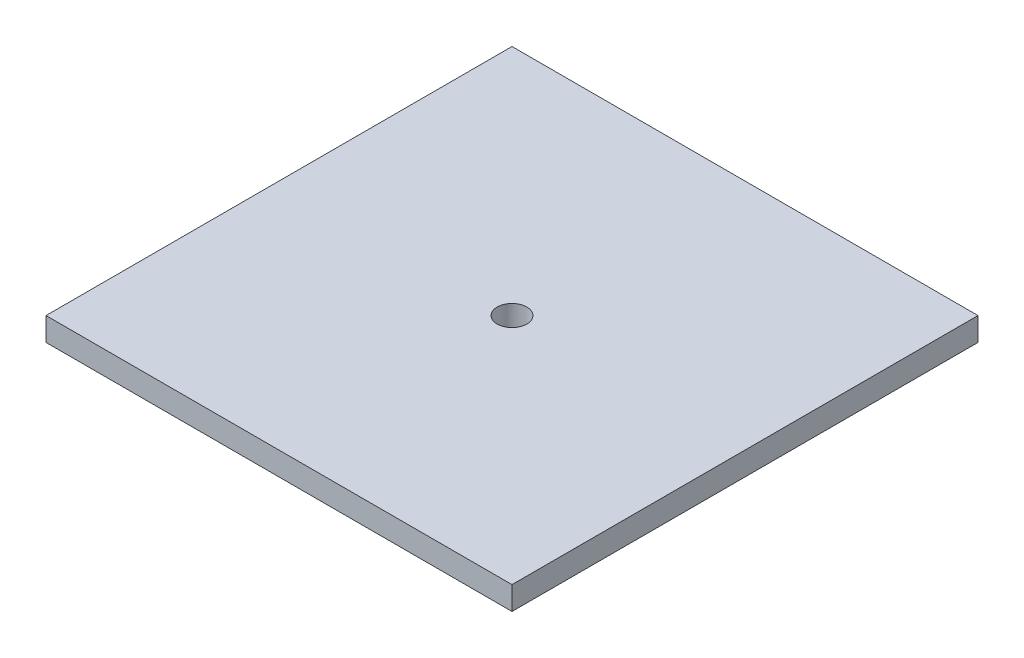
ISO-10303-21;
HEADER;
FILE_DESCRIPTION(('STEP AP214'),'2;1');
FILE_NAME('part.step','',(''),(''),'','','');
FILE_SCHEMA(('AUTOMOTIVE_DESIGN { 1 0 10303 214 1 1 1 1 }'));
ENDSEC;
DATA;
#1=APPLICATION_CONTEXT('core data for automotive mechanical design processes');
#2=APPLICATION_PROTOCOL_DEFINITION('international standard','automotive_design',2000,#1);
#3=PRODUCT_CONTEXT('',#1,'mechanical');
#4=PRODUCT('Part','Part','',(#3));
#5=PRODUCT_RELATED_PRODUCT_CATEGORY('part','',(#4));
#6=PRODUCT_DEFINITION_FORMATION('','',#4);
#7=PRODUCT_DEFINITION_CONTEXT('part definition',#1,'design');
#8=PRODUCT_DEFINITION('design','',#6,#7);
#9=PRODUCT_DEFINITION_SHAPE('','',#8);
#10=(LENGTH_UNIT() NAMED_UNIT(*) SI_UNIT(.MILLI.,.METRE.));
#11=(NAMED_UNIT(*) PLANE_ANGLE_UNIT() SI_UNIT($,.RADIAN.));
#12=(NAMED_UNIT(*) SI_UNIT($,.STERADIAN.) SOLID_ANGLE_UNIT());
#13=UNCERTAINTY_MEASURE_WITH_UNIT(LENGTH_MEASURE(1.E-05),#10,'distance_accuracy_value','');
#14=(GEOMETRIC_REPRESENTATION_CONTEXT(3) GLOBAL_UNCERTAINTY_ASSIGNED_CONTEXT((#13)) GLOBAL_UNIT_ASSIGNED_CONTEXT((#10,
#11,#12)) REPRESENTATION_CONTEXT('',''));
#15=CARTESIAN_POINT('',(0.,0.,0.));
#16=DIRECTION('',(0.,0.,1.));
#17=DIRECTION('',(1.,0.,0.));
#18=AXIS2_PLACEMENT_3D('',#15,#16,#17);
#19=CARTESIAN_POINT('',(0.,5.,0.));
#20=DIRECTION('',(0.,1.,0.));
#21=DIRECTION('',(0.,0.,1.));
#22=AXIS2_PLACEMENT_3D('',#19,#20,#21);
#23=PLANE('',#22);
#24=DIRECTION('',(0.,0.,1.));
#25=VECTOR('',#24,1.);
#26=CARTESIAN_POINT('',(-50.,5.,50.));
#27=LINE('',#26,#25);
#28=CARTESIAN_POINT('',(-50.,5.,-50.));
#29=VERTEX_POINT('',#28);
#30=CARTESIAN_POINT('',(-50.,5.,50.));
#31=VERTEX_POINT('',#30);
#32=EDGE_CURVE('E89',#29,#31,#27,.T.);
#33=ORIENTED_EDGE('',*,*,#32,.T.);
#34=DIRECTION('',(1.,0.,0.));
#35=VECTOR('',#34,1.);
#36=CARTESIAN_POINT('',(50.,5.,50.));
#37=LINE('',#36,#35);
#38=CARTESIAN_POINT('',(50.,5.,50.));
#39=VERTEX_POINT('',#38);
#40=EDGE_CURVE('E84',#31,#39,#37,.T.);
#41=ORIENTED_EDGE('',*,*,#40,.T.);
#42=DIRECTION('',(0.,0.,-1.));
#43=VECTOR('',#42,1.);
#44=CARTESIAN_POINT('',(50.,5.,50.));
#45=LINE('',#44,#43);
#46=CARTESIAN_POINT('',(50.,5.,-50.));
#47=VERTEX_POINT('',#46);
#48=EDGE_CURVE('E87',#39,#47,#45,.T.);
#49=ORIENTED_EDGE('',*,*,#48,.T.);
#50=DIRECTION('',(-1.,0.,0.));
#51=VECTOR('',#50,1.);
#52=CARTESIAN_POINT('',(50.,5.,-50.));
#53=LINE('',#52,#51);
#54=EDGE_CURVE('E54',#47,#29,#53,.T.);
#55=ORIENTED_EDGE('',*,*,#54,.T.);
#56=EDGE_LOOP('',(#33,#41,#49,#55));
#57=FACE_BOUND('',#56,.T.);
#58=CARTESIAN_POINT('',(0.,5.,0.));
#59=DIRECTION('',(0.,1.,0.));
#60=DIRECTION('',(0.,0.,1.));
#61=AXIS2_PLACEMENT_3D('',#58,#59,#60);
#62=CIRCLE('',#61,3.175);
#63=CARTESIAN_POINT('',(0.,5.,3.175));
#64=VERTEX_POINT('',#63);
#65=EDGE_CURVE('E104',#64,#64,#62,.T.);
#66=ORIENTED_EDGE('',*,*,#65,.F.);
#67=EDGE_LOOP('',(#66));
#68=FACE_BOUND('',#67,.T.);
#69=ADVANCED_FACE('F37',(#57,#68),#23,.T.);
#70=CARTESIAN_POINT('',(0.,0.,0.));
#71=DIRECTION('',(0.,1.,0.));
#72=DIRECTION('',(0.,0.,1.));
#73=AXIS2_PLACEMENT_3D('',#70,#71,#72);
#74=PLANE('',#73);
#75=DIRECTION('',(0.,0.,1.));
#76=VECTOR('',#75,1.);
#77=CARTESIAN_POINT('',(-50.,0.,50.));
#78=LINE('',#77,#76);
#79=CARTESIAN_POINT('',(-50.,0.,-50.));
#80=VERTEX_POINT('',#79);
#81=CARTESIAN_POINT('',(-50.,0.,50.));
#82=VERTEX_POINT('',#81);
#83=EDGE_CURVE('E101',#80,#82,#78,.T.);
#84=ORIENTED_EDGE('',*,*,#83,.F.);
#85=DIRECTION('',(-1.,0.,0.));
#86=VECTOR('',#85,1.);
#87=CARTESIAN_POINT('',(50.,0.,-50.));
#88=LINE('',#87,#86);
#89=CARTESIAN_POINT('',(50.,0.,-50.));
#90=VERTEX_POINT('',#89);
#91=EDGE_CURVE('E77',#90,#80,#88,.T.);
#92=ORIENTED_EDGE('',*,*,#91,.F.);
#93=DIRECTION('',(0.,0.,-1.));
#94=VECTOR('',#93,1.);
#95=CARTESIAN_POINT('',(50.,0.,50.));
#96=LINE('',#95,#94);
#97=CARTESIAN_POINT('',(50.,0.,50.));
#98=VERTEX_POINT('',#97);
#99=EDGE_CURVE('E71',#98,#90,#96,.T.);
#100=ORIENTED_EDGE('',*,*,#99,.F.);
#101=DIRECTION('',(1.,0.,0.));
#102=VECTOR('',#101,1.);
#103=CARTESIAN_POINT('',(50.,0.,50.));
#104=LINE('',#103,#102);
#105=EDGE_CURVE('E93',#82,#98,#104,.T.);
#106=ORIENTED_EDGE('',*,*,#105,.F.);
#107=EDGE_LOOP('',(#84,#92,#100,#106));
#108=FACE_BOUND('',#107,.T.);
#109=CARTESIAN_POINT('',(0.,0.,0.));
#110=DIRECTION('',(0.,1.,0.));
#111=DIRECTION('',(0.,0.,1.));
#112=AXIS2_PLACEMENT_3D('',#109,#110,#111);
#113=CIRCLE('',#112,3.175);
#114=CARTESIAN_POINT('',(0.,0.,3.175));
#115=VERTEX_POINT('',#114);
#116=EDGE_CURVE('E116',#115,#115,#113,.T.);
#117=ORIENTED_EDGE('',*,*,#116,.T.);
#118=EDGE_LOOP('',(#117));
#119=FACE_BOUND('',#118,.T.);
#120=ADVANCED_FACE('F112',(#108,#119),#74,.F.);
#121=CARTESIAN_POINT('',(-50.,5.,50.));
#122=DIRECTION('',(1.,0.,0.));
#123=DIRECTION('',(0.,0.,-1.));
#124=AXIS2_PLACEMENT_3D('',#121,#122,#123);
#125=PLANE('',#124);
#126=ORIENTED_EDGE('',*,*,#83,.T.);
#127=DIRECTION('',(0.,-1.,0.));
#128=VECTOR('',#127,1.);
#129=CARTESIAN_POINT('',(-50.,5.,50.));
#130=LINE('',#129,#128);
#131=EDGE_CURVE('E11',#31,#82,#130,.T.);
#132=ORIENTED_EDGE('',*,*,#131,.F.);
#133=ORIENTED_EDGE('',*,*,#32,.F.);
#134=DIRECTION('',(0.,-1.,0.));
#135=VECTOR('',#134,1.);
#136=CARTESIAN_POINT('',(-50.,5.,-50.));
#137=LINE('',#136,#135);
#138=EDGE_CURVE('E97',#29,#80,#137,.T.);
#139=ORIENTED_EDGE('',*,*,#138,.T.);
#140=EDGE_LOOP('',(#126,#132,#133,#139));
#141=FACE_BOUND('',#140,.T.);
#142=ADVANCED_FACE('F39',(#141),#125,.F.);
#143=CARTESIAN_POINT('',(50.,5.,50.));
#144=DIRECTION('',(0.,0.,-1.));
#145=DIRECTION('',(-1.,0.,0.));
#146=AXIS2_PLACEMENT_3D('',#143,#144,#145);
#147=PLANE('',#146);
#148=ORIENTED_EDGE('',*,*,#105,.T.);
#149=DIRECTION('',(0.,-1.,0.));
#150=VECTOR('',#149,1.);
#151=CARTESIAN_POINT('',(50.,5.,50.));
#152=LINE('',#151,#150);
#153=EDGE_CURVE('E46',#39,#98,#152,.T.);
#154=ORIENTED_EDGE('',*,*,#153,.F.);
#155=ORIENTED_EDGE('',*,*,#40,.F.);
#156=ORIENTED_EDGE('',*,*,#131,.T.);
#157=EDGE_LOOP('',(#148,#154,#155,#156));
#158=FACE_BOUND('',#157,.T.);
#159=ADVANCED_FACE('F92',(#158),#147,.F.);
#160=CARTESIAN_POINT('',(50.,5.,50.));
#161=DIRECTION('',(-1.,0.,0.));
#162=DIRECTION('',(0.,0.,1.));
#163=AXIS2_PLACEMENT_3D('',#160,#161,#162);
#164=PLANE('',#163);
#165=ORIENTED_EDGE('',*,*,#99,.T.);
#166=DIRECTION('',(0.,-1.,0.));
#167=VECTOR('',#166,1.);
#168=CARTESIAN_POINT('',(50.,5.,-50.));
#169=LINE('',#168,#167);
#170=EDGE_CURVE('E94',#47,#90,#169,.T.);
#171=ORIENTED_EDGE('',*,*,#170,.F.);
#172=ORIENTED_EDGE('',*,*,#48,.F.);
#173=ORIENTED_EDGE('',*,*,#153,.T.);
#174=EDGE_LOOP('',(#165,#171,#172,#173));
#175=FACE_BOUND('',#174,.T.);
#176=ADVANCED_FACE('F95',(#175),#164,.F.);
#177=CARTESIAN_POINT('',(50.,5.,-50.));
#178=DIRECTION('',(0.,0.,1.));
#179=DIRECTION('',(1.,0.,0.));
#180=AXIS2_PLACEMENT_3D('',#177,#178,#179);
#181=PLANE('',#180);
#182=ORIENTED_EDGE('',*,*,#91,.T.);
#183=ORIENTED_EDGE('',*,*,#138,.F.);
#184=ORIENTED_EDGE('',*,*,#54,.F.);
#185=ORIENTED_EDGE('',*,*,#170,.T.);
#186=EDGE_LOOP('',(#182,#183,#184,#185));
#187=FACE_BOUND('',#186,.T.);
#188=ADVANCED_FACE('F109',(#187),#181,.F.);
#189=CARTESIAN_POINT('',(0.,5.,0.));
#190=DIRECTION('',(0.,-1.,0.));
#191=DIRECTION('',(0.,0.,-1.));
#192=AXIS2_PLACEMENT_3D('',#189,#190,#191);
#193=CYLINDRICAL_SURFACE('',#192,3.175);
#194=ORIENTED_EDGE('',*,*,#65,.T.);
#195=EDGE_LOOP('',(#194));
#196=FACE_BOUND('',#195,.T.);
#197=ORIENTED_EDGE('',*,*,#116,.F.);
#198=EDGE_LOOP('',(#197));
#199=FACE_BOUND('',#198,.T.);
#200=ADVANCED_FACE('F122',(#196,#199),#193,.F.);
#201=CLOSED_SHELL('',(#69,#120,#142,#159,#176,#188,#200));
#202=MANIFOLD_SOLID_BREP('B2',#201);
#203=ADVANCED_BREP_SHAPE_REPRESENTATION('',(#18,#202),#14);
#204=SHAPE_DEFINITION_REPRESENTATION(#9,#203);
ENDSEC;
END-ISO-10303-21;
